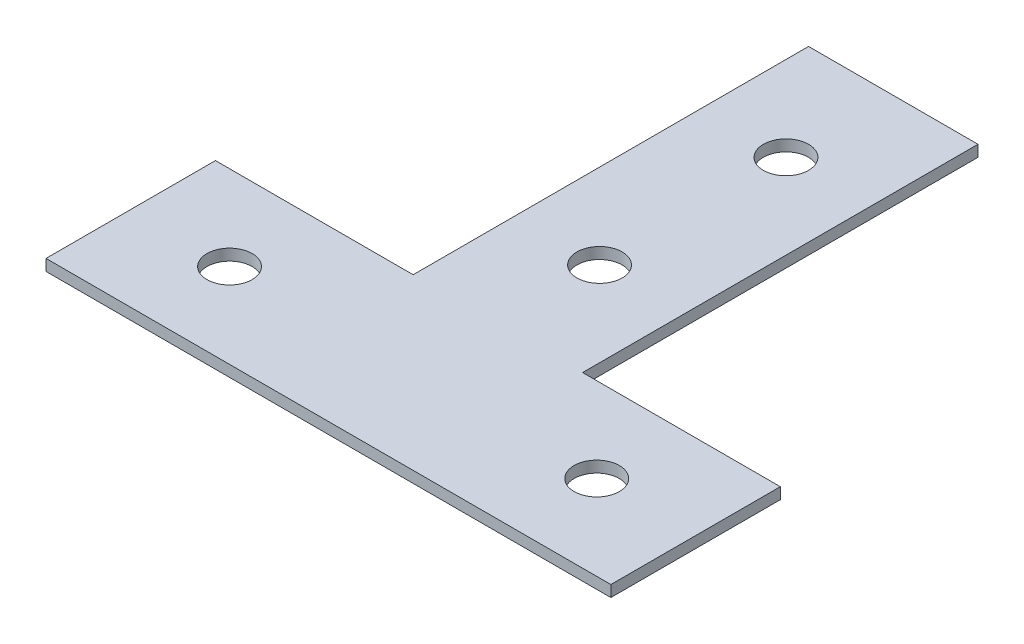
ISO-10303-21;
HEADER;
FILE_DESCRIPTION(('STEP AP214'),'2;1');
FILE_NAME('part.step','',(''),(''),'','','');
FILE_SCHEMA(('AUTOMOTIVE_DESIGN { 1 0 10303 214 1 1 1 1 }'));
ENDSEC;
DATA;
#1=APPLICATION_CONTEXT('core data for automotive mechanical design processes');
#2=APPLICATION_PROTOCOL_DEFINITION('international standard','automotive_design',2000,#1);
#3=PRODUCT_CONTEXT('',#1,'mechanical');
#4=PRODUCT('Part','Part','',(#3));
#5=PRODUCT_RELATED_PRODUCT_CATEGORY('part','',(#4));
#6=PRODUCT_DEFINITION_FORMATION('','',#4);
#7=PRODUCT_DEFINITION_CONTEXT('part definition',#1,'design');
#8=PRODUCT_DEFINITION('design','',#6,#7);
#9=PRODUCT_DEFINITION_SHAPE('','',#8);
#10=(LENGTH_UNIT() NAMED_UNIT(*) SI_UNIT(.MILLI.,.METRE.));
#11=(NAMED_UNIT(*) PLANE_ANGLE_UNIT() SI_UNIT($,.RADIAN.));
#12=(NAMED_UNIT(*) SI_UNIT($,.STERADIAN.) SOLID_ANGLE_UNIT());
#13=UNCERTAINTY_MEASURE_WITH_UNIT(LENGTH_MEASURE(1.E-05),#10,'distance_accuracy_value','');
#14=(GEOMETRIC_REPRESENTATION_CONTEXT(3) GLOBAL_UNCERTAINTY_ASSIGNED_CONTEXT((#13)) GLOBAL_UNIT_ASSIGNED_CONTEXT((#10,
#11,#12)) REPRESENTATION_CONTEXT('',''));
#15=CARTESIAN_POINT('',(0.,0.,0.));
#16=DIRECTION('',(0.,0.,1.));
#17=DIRECTION('',(1.,0.,0.));
#18=AXIS2_PLACEMENT_3D('',#15,#16,#17);
#19=CARTESIAN_POINT('',(32.5,1.,-15.));
#20=DIRECTION('',(0.,0.,1.));
#21=DIRECTION('',(1.,0.,0.));
#22=AXIS2_PLACEMENT_3D('',#19,#20,#21);
#23=PLANE('',#22);
#24=DIRECTION('',(-1.,0.,0.));
#25=VECTOR('',#24,1.);
#26=CARTESIAN_POINT('',(32.5,0.,-15.));
#27=LINE('',#26,#25);
#28=CARTESIAN_POINT('',(50.,0.,-15.));
#29=VERTEX_POINT('',#28);
#30=CARTESIAN_POINT('',(32.5,0.,-15.));
#31=VERTEX_POINT('',#30);
#32=EDGE_CURVE('E140',#29,#31,#27,.T.);
#33=ORIENTED_EDGE('',*,*,#32,.T.);
#34=DIRECTION('',(0.,-1.,0.));
#35=VECTOR('',#34,1.);
#36=CARTESIAN_POINT('',(32.5,1.,-15.));
#37=LINE('',#36,#35);
#38=CARTESIAN_POINT('',(32.5,1.,-15.));
#39=VERTEX_POINT('',#38);
#40=EDGE_CURVE('E11',#39,#31,#37,.T.);
#41=ORIENTED_EDGE('',*,*,#40,.F.);
#42=DIRECTION('',(-1.,0.,0.));
#43=VECTOR('',#42,1.);
#44=CARTESIAN_POINT('',(32.5,1.,-15.));
#45=LINE('',#44,#43);
#46=CARTESIAN_POINT('',(50.,1.,-15.));
#47=VERTEX_POINT('',#46);
#48=EDGE_CURVE('E163',#47,#39,#45,.T.);
#49=ORIENTED_EDGE('',*,*,#48,.F.);
#50=DIRECTION('',(0.,-1.,0.));
#51=VECTOR('',#50,1.);
#52=CARTESIAN_POINT('',(50.,1.,-15.));
#53=LINE('',#52,#51);
#54=EDGE_CURVE('E136',#47,#29,#53,.T.);
#55=ORIENTED_EDGE('',*,*,#54,.T.);
#56=EDGE_LOOP('',(#33,#41,#49,#55));
#57=FACE_BOUND('',#56,.T.);
#58=ADVANCED_FACE('F39',(#57),#23,.F.);
#59=CARTESIAN_POINT('',(32.5,1.,-50.));
#60=DIRECTION('',(-1.,0.,0.));
#61=DIRECTION('',(0.,0.,1.));
#62=AXIS2_PLACEMENT_3D('',#59,#60,#61);
#63=PLANE('',#62);
#64=DIRECTION('',(0.,0.,-1.));
#65=VECTOR('',#64,1.);
#66=CARTESIAN_POINT('',(32.5,0.,-50.));
#67=LINE('',#66,#65);
#68=CARTESIAN_POINT('',(32.5,0.,-50.));
#69=VERTEX_POINT('',#68);
#70=EDGE_CURVE('E144',#31,#69,#67,.T.);
#71=ORIENTED_EDGE('',*,*,#70,.T.);
#72=DIRECTION('',(0.,-1.,0.));
#73=VECTOR('',#72,1.);
#74=CARTESIAN_POINT('',(32.5,1.,-50.));
#75=LINE('',#74,#73);
#76=CARTESIAN_POINT('',(32.5,1.,-50.));
#77=VERTEX_POINT('',#76);
#78=EDGE_CURVE('E48',#77,#69,#75,.T.);
#79=ORIENTED_EDGE('',*,*,#78,.F.);
#80=DIRECTION('',(0.,0.,-1.));
#81=VECTOR('',#80,1.);
#82=CARTESIAN_POINT('',(32.5,1.,-50.));
#83=LINE('',#82,#81);
#84=EDGE_CURVE('E99',#39,#77,#83,.T.);
#85=ORIENTED_EDGE('',*,*,#84,.F.);
#86=ORIENTED_EDGE('',*,*,#40,.T.);
#87=EDGE_LOOP('',(#71,#79,#85,#86));
#88=FACE_BOUND('',#87,.T.);
#89=ADVANCED_FACE('F272',(#88),#63,.F.);
#90=CARTESIAN_POINT('',(17.5,1.,-50.));
#91=DIRECTION('',(0.,0.,1.));
#92=DIRECTION('',(1.,0.,0.));
#93=AXIS2_PLACEMENT_3D('',#90,#91,#92);
#94=PLANE('',#93);
#95=DIRECTION('',(-1.,0.,0.));
#96=VECTOR('',#95,1.);
#97=CARTESIAN_POINT('',(17.5,0.,-50.));
#98=LINE('',#97,#96);
#99=CARTESIAN_POINT('',(17.5,0.,-50.));
#100=VERTEX_POINT('',#99);
#101=EDGE_CURVE('E148',#69,#100,#98,.T.);
#102=ORIENTED_EDGE('',*,*,#101,.T.);
#103=DIRECTION('',(0.,-1.,0.));
#104=VECTOR('',#103,1.);
#105=CARTESIAN_POINT('',(17.5,1.,-50.));
#106=LINE('',#105,#104);
#107=CARTESIAN_POINT('',(17.5,1.,-50.));
#108=VERTEX_POINT('',#107);
#109=EDGE_CURVE('E174',#108,#100,#106,.T.);
#110=ORIENTED_EDGE('',*,*,#109,.F.);
#111=DIRECTION('',(-1.,0.,0.));
#112=VECTOR('',#111,1.);
#113=CARTESIAN_POINT('',(17.5,1.,-50.));
#114=LINE('',#113,#112);
#115=EDGE_CURVE('E184',#77,#108,#114,.T.);
#116=ORIENTED_EDGE('',*,*,#115,.F.);
#117=ORIENTED_EDGE('',*,*,#78,.T.);
#118=EDGE_LOOP('',(#102,#110,#116,#117));
#119=FACE_BOUND('',#118,.T.);
#120=ADVANCED_FACE('F182',(#119),#94,.F.);
#121=CARTESIAN_POINT('',(17.5,1.,-50.));
#122=DIRECTION('',(1.,0.,0.));
#123=DIRECTION('',(0.,0.,-1.));
#124=AXIS2_PLACEMENT_3D('',#121,#122,#123);
#125=PLANE('',#124);
#126=DIRECTION('',(0.,0.,1.));
#127=VECTOR('',#126,1.);
#128=CARTESIAN_POINT('',(17.5,0.,-50.));
#129=LINE('',#128,#127);
#130=CARTESIAN_POINT('',(17.5,0.,-15.));
#131=VERTEX_POINT('',#130);
#132=EDGE_CURVE('E151',#100,#131,#129,.T.);
#133=ORIENTED_EDGE('',*,*,#132,.T.);
#134=DIRECTION('',(0.,-1.,0.));
#135=VECTOR('',#134,1.);
#136=CARTESIAN_POINT('',(17.5,1.,-15.));
#137=LINE('',#136,#135);
#138=CARTESIAN_POINT('',(17.5,1.,-15.));
#139=VERTEX_POINT('',#138);
#140=EDGE_CURVE('E170',#139,#131,#137,.T.);
#141=ORIENTED_EDGE('',*,*,#140,.F.);
#142=DIRECTION('',(0.,0.,1.));
#143=VECTOR('',#142,1.);
#144=CARTESIAN_POINT('',(17.5,1.,-50.));
#145=LINE('',#144,#143);
#146=EDGE_CURVE('E197',#108,#139,#145,.T.);
#147=ORIENTED_EDGE('',*,*,#146,.F.);
#148=ORIENTED_EDGE('',*,*,#109,.T.);
#149=EDGE_LOOP('',(#133,#141,#147,#148));
#150=FACE_BOUND('',#149,.T.);
#151=ADVANCED_FACE('F192',(#150),#125,.F.);
#152=CARTESIAN_POINT('',(17.5,1.,-15.));
#153=DIRECTION('',(0.,0.,1.));
#154=DIRECTION('',(1.,0.,0.));
#155=AXIS2_PLACEMENT_3D('',#152,#153,#154);
#156=PLANE('',#155);
#157=DIRECTION('',(-1.,0.,0.));
#158=VECTOR('',#157,1.);
#159=CARTESIAN_POINT('',(17.5,0.,-15.));
#160=LINE('',#159,#158);
#161=CARTESIAN_POINT('',(0.,0.,-15.));
#162=VERTEX_POINT('',#161);
#163=EDGE_CURVE('E154',#131,#162,#160,.T.);
#164=ORIENTED_EDGE('',*,*,#163,.T.);
#165=DIRECTION('',(0.,-1.,0.));
#166=VECTOR('',#165,1.);
#167=CARTESIAN_POINT('',(0.,1.,-15.));
#168=LINE('',#167,#166);
#169=CARTESIAN_POINT('',(0.,1.,-15.));
#170=VERTEX_POINT('',#169);
#171=EDGE_CURVE('E129',#170,#162,#168,.T.);
#172=ORIENTED_EDGE('',*,*,#171,.F.);
#173=DIRECTION('',(-1.,0.,0.));
#174=VECTOR('',#173,1.);
#175=CARTESIAN_POINT('',(17.5,1.,-15.));
#176=LINE('',#175,#174);
#177=EDGE_CURVE('E118',#139,#170,#176,.T.);
#178=ORIENTED_EDGE('',*,*,#177,.F.);
#179=ORIENTED_EDGE('',*,*,#140,.T.);
#180=EDGE_LOOP('',(#164,#172,#178,#179));
#181=FACE_BOUND('',#180,.T.);
#182=ADVANCED_FACE('F195',(#181),#156,.F.);
#183=CARTESIAN_POINT('',(0.,1.,-15.));
#184=DIRECTION('',(1.,0.,0.));
#185=DIRECTION('',(0.,0.,-1.));
#186=AXIS2_PLACEMENT_3D('',#183,#184,#185);
#187=PLANE('',#186);
#188=DIRECTION('',(0.,0.,1.));
#189=VECTOR('',#188,1.);
#190=CARTESIAN_POINT('',(0.,0.,-15.));
#191=LINE('',#190,#189);
#192=CARTESIAN_POINT('',(0.,0.,0.));
#193=VERTEX_POINT('',#192);
#194=EDGE_CURVE('E127',#162,#193,#191,.T.);
#195=ORIENTED_EDGE('',*,*,#194,.T.);
#196=DIRECTION('',(0.,-1.,0.));
#197=VECTOR('',#196,1.);
#198=CARTESIAN_POINT('',(0.,1.,0.));
#199=LINE('',#198,#197);
#200=CARTESIAN_POINT('',(0.,1.,0.));
#201=VERTEX_POINT('',#200);
#202=EDGE_CURVE('E124',#201,#193,#199,.T.);
#203=ORIENTED_EDGE('',*,*,#202,.F.);
#204=DIRECTION('',(0.,0.,1.));
#205=VECTOR('',#204,1.);
#206=CARTESIAN_POINT('',(0.,1.,-15.));
#207=LINE('',#206,#205);
#208=EDGE_CURVE('E112',#170,#201,#207,.T.);
#209=ORIENTED_EDGE('',*,*,#208,.F.);
#210=ORIENTED_EDGE('',*,*,#171,.T.);
#211=EDGE_LOOP('',(#195,#203,#209,#210));
#212=FACE_BOUND('',#211,.T.);
#213=ADVANCED_FACE('F125',(#212),#187,.F.);
#214=CARTESIAN_POINT('',(50.,1.,0.));
#215=DIRECTION('',(0.,0.,-1.));
#216=DIRECTION('',(-1.,0.,0.));
#217=AXIS2_PLACEMENT_3D('',#214,#215,#216);
#218=PLANE('',#217);
#219=DIRECTION('',(1.,0.,0.));
#220=VECTOR('',#219,1.);
#221=CARTESIAN_POINT('',(50.,0.,0.));
#222=LINE('',#221,#220);
#223=CARTESIAN_POINT('',(50.,0.,0.));
#224=VERTEX_POINT('',#223);
#225=EDGE_CURVE('E85',#193,#224,#222,.T.);
#226=ORIENTED_EDGE('',*,*,#225,.T.);
#227=DIRECTION('',(0.,-1.,0.));
#228=VECTOR('',#227,1.);
#229=CARTESIAN_POINT('',(50.,1.,0.));
#230=LINE('',#229,#228);
#231=CARTESIAN_POINT('',(50.,1.,0.));
#232=VERTEX_POINT('',#231);
#233=EDGE_CURVE('E130',#232,#224,#230,.T.);
#234=ORIENTED_EDGE('',*,*,#233,.F.);
#235=DIRECTION('',(1.,0.,0.));
#236=VECTOR('',#235,1.);
#237=CARTESIAN_POINT('',(50.,1.,0.));
#238=LINE('',#237,#236);
#239=EDGE_CURVE('E116',#201,#232,#238,.T.);
#240=ORIENTED_EDGE('',*,*,#239,.F.);
#241=ORIENTED_EDGE('',*,*,#202,.T.);
#242=EDGE_LOOP('',(#226,#234,#240,#241));
#243=FACE_BOUND('',#242,.T.);
#244=ADVANCED_FACE('F132',(#243),#218,.F.);
#245=CARTESIAN_POINT('',(50.,1.,-15.));
#246=DIRECTION('',(-1.,0.,0.));
#247=DIRECTION('',(0.,0.,1.));
#248=AXIS2_PLACEMENT_3D('',#245,#246,#247);
#249=PLANE('',#248);
#250=DIRECTION('',(0.,0.,-1.));
#251=VECTOR('',#250,1.);
#252=CARTESIAN_POINT('',(50.,0.,-15.));
#253=LINE('',#252,#251);
#254=EDGE_CURVE('E91',#224,#29,#253,.T.);
#255=ORIENTED_EDGE('',*,*,#254,.T.);
#256=ORIENTED_EDGE('',*,*,#54,.F.);
#257=DIRECTION('',(0.,0.,-1.));
#258=VECTOR('',#257,1.);
#259=CARTESIAN_POINT('',(50.,1.,-15.));
#260=LINE('',#259,#258);
#261=EDGE_CURVE('E56',#232,#47,#260,.T.);
#262=ORIENTED_EDGE('',*,*,#261,.F.);
#263=ORIENTED_EDGE('',*,*,#233,.T.);
#264=EDGE_LOOP('',(#255,#256,#262,#263));
#265=FACE_BOUND('',#264,.T.);
#266=ADVANCED_FACE('F250',(#265),#249,.F.);
#267=CARTESIAN_POINT('',(0.,1.,0.));
#268=DIRECTION('',(0.,-1.,0.));
#269=DIRECTION('',(0.,0.,-1.));
#270=AXIS2_PLACEMENT_3D('',#267,#268,#269);
#271=PLANE('',#270);
#272=CARTESIAN_POINT('',(41.25,1.,-7.5));
#273=DIRECTION('',(0.,-1.,0.));
#274=DIRECTION('',(0.,0.,-1.));
#275=AXIS2_PLACEMENT_3D('',#272,#273,#274);
#276=CIRCLE('',#275,2.);
#277=CARTESIAN_POINT('',(41.25,1.,-9.5));
#278=VERTEX_POINT('',#277);
#279=EDGE_CURVE('E145',#278,#278,#276,.T.);
#280=ORIENTED_EDGE('',*,*,#279,.T.);
#281=EDGE_LOOP('',(#280));
#282=FACE_BOUND('',#281,.T.);
#283=CARTESIAN_POINT('',(25.,1.,-40.5));
#284=DIRECTION('',(0.,-1.,0.));
#285=DIRECTION('',(0.,0.,-1.));
#286=AXIS2_PLACEMENT_3D('',#283,#284,#285);
#287=CIRCLE('',#286,2.);
#288=CARTESIAN_POINT('',(25.,1.,-42.5));
#289=VERTEX_POINT('',#288);
#290=EDGE_CURVE('E210',#289,#289,#287,.T.);
#291=ORIENTED_EDGE('',*,*,#290,.T.);
#292=EDGE_LOOP('',(#291));
#293=FACE_BOUND('',#292,.T.);
#294=CARTESIAN_POINT('',(25.,1.,-24.));
#295=DIRECTION('',(0.,-1.,0.));
#296=DIRECTION('',(0.,0.,-1.));
#297=AXIS2_PLACEMENT_3D('',#294,#295,#296);
#298=CIRCLE('',#297,2.);
#299=CARTESIAN_POINT('',(25.,1.,-26.));
#300=VERTEX_POINT('',#299);
#301=EDGE_CURVE('E214',#300,#300,#298,.T.);
#302=ORIENTED_EDGE('',*,*,#301,.T.);
#303=EDGE_LOOP('',(#302));
#304=FACE_BOUND('',#303,.T.);
#305=CARTESIAN_POINT('',(8.75,1.,-7.5));
#306=DIRECTION('',(0.,-1.,0.));
#307=DIRECTION('',(0.,0.,-1.));
#308=AXIS2_PLACEMENT_3D('',#305,#306,#307);
#309=CIRCLE('',#308,2.);
#310=CARTESIAN_POINT('',(8.75,1.,-9.5));
#311=VERTEX_POINT('',#310);
#312=EDGE_CURVE('E218',#311,#311,#309,.T.);
#313=ORIENTED_EDGE('',*,*,#312,.T.);
#314=EDGE_LOOP('',(#313));
#315=FACE_BOUND('',#314,.T.);
#316=ORIENTED_EDGE('',*,*,#48,.T.);
#317=ORIENTED_EDGE('',*,*,#84,.T.);
#318=ORIENTED_EDGE('',*,*,#115,.T.);
#319=ORIENTED_EDGE('',*,*,#146,.T.);
#320=ORIENTED_EDGE('',*,*,#177,.T.);
#321=ORIENTED_EDGE('',*,*,#208,.T.);
#322=ORIENTED_EDGE('',*,*,#239,.T.);
#323=ORIENTED_EDGE('',*,*,#261,.T.);
#324=EDGE_LOOP('',(#316,#317,#318,#319,#320,#321,#322,#323));
#325=FACE_BOUND('',#324,.T.);
#326=ADVANCED_FACE('F114',(#282,#293,#304,#315,#325),#271,.F.);
#327=CARTESIAN_POINT('',(0.,0.,0.));
#328=DIRECTION('',(0.,-1.,0.));
#329=DIRECTION('',(0.,0.,-1.));
#330=AXIS2_PLACEMENT_3D('',#327,#328,#329);
#331=PLANE('',#330);
#332=CARTESIAN_POINT('',(41.25,0.,-7.5));
#333=DIRECTION('',(0.,1.,0.));
#334=DIRECTION('',(0.,0.,1.));
#335=AXIS2_PLACEMENT_3D('',#332,#333,#334);
#336=CIRCLE('',#335,2.);
#337=CARTESIAN_POINT('',(41.25,0.,-5.5));
#338=VERTEX_POINT('',#337);
#339=EDGE_CURVE('E222',#338,#338,#336,.T.);
#340=ORIENTED_EDGE('',*,*,#339,.T.);
#341=EDGE_LOOP('',(#340));
#342=FACE_BOUND('',#341,.T.);
#343=CARTESIAN_POINT('',(25.,0.,-40.5));
#344=DIRECTION('',(0.,1.,0.));
#345=DIRECTION('',(0.,0.,1.));
#346=AXIS2_PLACEMENT_3D('',#343,#344,#345);
#347=CIRCLE('',#346,2.);
#348=CARTESIAN_POINT('',(25.,0.,-38.5));
#349=VERTEX_POINT('',#348);
#350=EDGE_CURVE('E231',#349,#349,#347,.T.);
#351=ORIENTED_EDGE('',*,*,#350,.T.);
#352=EDGE_LOOP('',(#351));
#353=FACE_BOUND('',#352,.T.);
#354=CARTESIAN_POINT('',(25.,0.,-24.));
#355=DIRECTION('',(0.,1.,0.));
#356=DIRECTION('',(0.,0.,1.));
#357=AXIS2_PLACEMENT_3D('',#354,#355,#356);
#358=CIRCLE('',#357,2.);
#359=CARTESIAN_POINT('',(25.,0.,-22.));
#360=VERTEX_POINT('',#359);
#361=EDGE_CURVE('E227',#360,#360,#358,.T.);
#362=ORIENTED_EDGE('',*,*,#361,.T.);
#363=EDGE_LOOP('',(#362));
#364=FACE_BOUND('',#363,.T.);
#365=CARTESIAN_POINT('',(8.75,0.,-7.5));
#366=DIRECTION('',(0.,1.,0.));
#367=DIRECTION('',(0.,0.,1.));
#368=AXIS2_PLACEMENT_3D('',#365,#366,#367);
#369=CIRCLE('',#368,2.);
#370=CARTESIAN_POINT('',(8.75,0.,-5.5));
#371=VERTEX_POINT('',#370);
#372=EDGE_CURVE('E223',#371,#371,#369,.T.);
#373=ORIENTED_EDGE('',*,*,#372,.T.);
#374=EDGE_LOOP('',(#373));
#375=FACE_BOUND('',#374,.T.);
#376=ORIENTED_EDGE('',*,*,#32,.F.);
#377=ORIENTED_EDGE('',*,*,#254,.F.);
#378=ORIENTED_EDGE('',*,*,#225,.F.);
#379=ORIENTED_EDGE('',*,*,#194,.F.);
#380=ORIENTED_EDGE('',*,*,#163,.F.);
#381=ORIENTED_EDGE('',*,*,#132,.F.);
#382=ORIENTED_EDGE('',*,*,#101,.F.);
#383=ORIENTED_EDGE('',*,*,#70,.F.);
#384=EDGE_LOOP('',(#376,#377,#378,#379,#380,#381,#382,#383));
#385=FACE_BOUND('',#384,.T.);
#386=ADVANCED_FACE('F188',(#342,#353,#364,#375,#385),#331,.T.);
#387=CARTESIAN_POINT('',(8.75,0.,-7.5));
#388=DIRECTION('',(0.,1.,0.));
#389=DIRECTION('',(0.,0.,1.));
#390=AXIS2_PLACEMENT_3D('',#387,#388,#389);
#391=CYLINDRICAL_SURFACE('',#390,2.);
#392=ORIENTED_EDGE('',*,*,#372,.F.);
#393=EDGE_LOOP('',(#392));
#394=FACE_BOUND('',#393,.T.);
#395=ORIENTED_EDGE('',*,*,#312,.F.);
#396=EDGE_LOOP('',(#395));
#397=FACE_BOUND('',#396,.T.);
#398=ADVANCED_FACE('F258',(#394,#397),#391,.F.);
#399=CARTESIAN_POINT('',(25.,0.,-24.));
#400=DIRECTION('',(0.,1.,0.));
#401=DIRECTION('',(0.,0.,1.));
#402=AXIS2_PLACEMENT_3D('',#399,#400,#401);
#403=CYLINDRICAL_SURFACE('',#402,2.);
#404=ORIENTED_EDGE('',*,*,#361,.F.);
#405=EDGE_LOOP('',(#404));
#406=FACE_BOUND('',#405,.T.);
#407=ORIENTED_EDGE('',*,*,#301,.F.);
#408=EDGE_LOOP('',(#407));
#409=FACE_BOUND('',#408,.T.);
#410=ADVANCED_FACE('F260',(#406,#409),#403,.F.);
#411=CARTESIAN_POINT('',(25.,0.,-40.5));
#412=DIRECTION('',(0.,1.,0.));
#413=DIRECTION('',(0.,0.,1.));
#414=AXIS2_PLACEMENT_3D('',#411,#412,#413);
#415=CYLINDRICAL_SURFACE('',#414,2.);
#416=ORIENTED_EDGE('',*,*,#350,.F.);
#417=EDGE_LOOP('',(#416));
#418=FACE_BOUND('',#417,.T.);
#419=ORIENTED_EDGE('',*,*,#290,.F.);
#420=EDGE_LOOP('',(#419));
#421=FACE_BOUND('',#420,.T.);
#422=ADVANCED_FACE('F244',(#418,#421),#415,.F.);
#423=CARTESIAN_POINT('',(41.25,0.,-7.5));
#424=DIRECTION('',(0.,1.,0.));
#425=DIRECTION('',(0.,0.,1.));
#426=AXIS2_PLACEMENT_3D('',#423,#424,#425);
#427=CYLINDRICAL_SURFACE('',#426,2.);
#428=ORIENTED_EDGE('',*,*,#339,.F.);
#429=EDGE_LOOP('',(#428));
#430=FACE_BOUND('',#429,.T.);
#431=ORIENTED_EDGE('',*,*,#279,.F.);
#432=EDGE_LOOP('',(#431));
#433=FACE_BOUND('',#432,.T.);
#434=ADVANCED_FACE('F241',(#430,#433),#427,.F.);
#435=CLOSED_SHELL('',(#58,#89,#120,#151,#182,#213,#244,#266,#326,#386,#398,#410,#422,#434));
#436=MANIFOLD_SOLID_BREP('B2',#435);
#437=ADVANCED_BREP_SHAPE_REPRESENTATION('',(#18,#436),#14);
#438=SHAPE_DEFINITION_REPRESENTATION(#9,#437);
ENDSEC;
END-ISO-10303-21;
